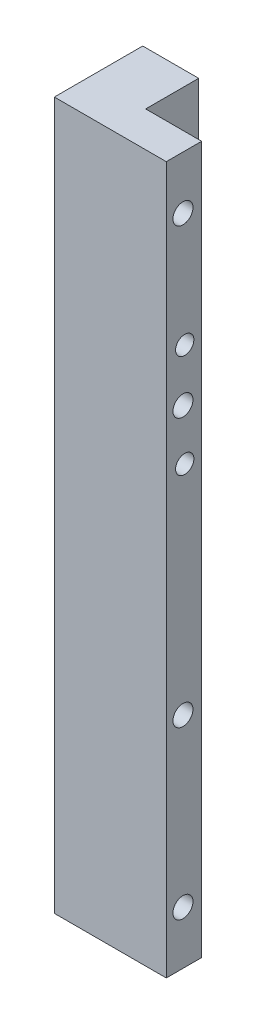
ISO-10303-21;
HEADER;
FILE_DESCRIPTION(('STEP AP214'),'2;1');
FILE_NAME('part.step','',(''),(''),'','','');
FILE_SCHEMA(('AUTOMOTIVE_DESIGN { 1 0 10303 214 1 1 1 1 }'));
ENDSEC;
DATA;
#1=APPLICATION_CONTEXT('core data for automotive mechanical design processes');
#2=APPLICATION_PROTOCOL_DEFINITION('international standard','automotive_design',2000,#1);
#3=PRODUCT_CONTEXT('',#1,'mechanical');
#4=PRODUCT('Part','Part','',(#3));
#5=PRODUCT_RELATED_PRODUCT_CATEGORY('part','',(#4));
#6=PRODUCT_DEFINITION_FORMATION('','',#4);
#7=PRODUCT_DEFINITION_CONTEXT('part definition',#1,'design');
#8=PRODUCT_DEFINITION('design','',#6,#7);
#9=PRODUCT_DEFINITION_SHAPE('','',#8);
#10=(LENGTH_UNIT() NAMED_UNIT(*) SI_UNIT(.MILLI.,.METRE.));
#11=(NAMED_UNIT(*) PLANE_ANGLE_UNIT() SI_UNIT($,.RADIAN.));
#12=(NAMED_UNIT(*) SI_UNIT($,.STERADIAN.) SOLID_ANGLE_UNIT());
#13=UNCERTAINTY_MEASURE_WITH_UNIT(LENGTH_MEASURE(1.E-05),#10,'distance_accuracy_value','');
#14=(GEOMETRIC_REPRESENTATION_CONTEXT(3) GLOBAL_UNCERTAINTY_ASSIGNED_CONTEXT((#13)) GLOBAL_UNIT_ASSIGNED_CONTEXT((#10,
#11,#12)) REPRESENTATION_CONTEXT('',''));
#15=CARTESIAN_POINT('',(0.,0.,0.));
#16=DIRECTION('',(0.,0.,1.));
#17=DIRECTION('',(1.,0.,0.));
#18=AXIS2_PLACEMENT_3D('',#15,#16,#17);
#19=CARTESIAN_POINT('',(0.,120.,3.));
#20=DIRECTION('',(0.,0.,-1.));
#21=DIRECTION('',(-1.,0.,0.));
#22=AXIS2_PLACEMENT_3D('',#19,#20,#21);
#23=PLANE('',#22);
#24=DIRECTION('',(1.,0.,0.));
#25=VECTOR('',#24,1.);
#26=CARTESIAN_POINT('',(0.,0.,3.));
#27=LINE('',#26,#25);
#28=CARTESIAN_POINT('',(-9.5,0.,3.));
#29=VERTEX_POINT('',#28);
#30=CARTESIAN_POINT('',(9.5,0.,3.));
#31=VERTEX_POINT('',#30);
#32=EDGE_CURVE('E119',#29,#31,#27,.T.);
#33=ORIENTED_EDGE('',*,*,#32,.T.);
#34=DIRECTION('',(0.,-1.,0.));
#35=VECTOR('',#34,1.);
#36=CARTESIAN_POINT('',(9.5,120.,3.));
#37=LINE('',#36,#35);
#38=CARTESIAN_POINT('',(9.5,120.,3.));
#39=VERTEX_POINT('',#38);
#40=EDGE_CURVE('E11',#39,#31,#37,.T.);
#41=ORIENTED_EDGE('',*,*,#40,.F.);
#42=DIRECTION('',(1.,0.,0.));
#43=VECTOR('',#42,1.);
#44=CARTESIAN_POINT('',(0.,120.,3.));
#45=LINE('',#44,#43);
#46=CARTESIAN_POINT('',(-9.5,120.,3.));
#47=VERTEX_POINT('',#46);
#48=EDGE_CURVE('E134',#47,#39,#45,.T.);
#49=ORIENTED_EDGE('',*,*,#48,.F.);
#50=DIRECTION('',(0.,-1.,0.));
#51=VECTOR('',#50,1.);
#52=CARTESIAN_POINT('',(-9.5,120.,3.));
#53=LINE('',#52,#51);
#54=EDGE_CURVE('E51',#47,#29,#53,.T.);
#55=ORIENTED_EDGE('',*,*,#54,.T.);
#56=EDGE_LOOP('',(#33,#41,#49,#55));
#57=FACE_BOUND('',#56,.T.);
#58=ADVANCED_FACE('F35',(#57),#23,.F.);
#59=CARTESIAN_POINT('',(9.5,120.,0.));
#60=DIRECTION('',(-1.,0.,0.));
#61=DIRECTION('',(0.,0.,1.));
#62=AXIS2_PLACEMENT_3D('',#59,#60,#61);
#63=PLANE('',#62);
#64=CARTESIAN_POINT('',(9.5,111.,0.170877535680921));
#65=DIRECTION('',(1.,0.,0.));
#66=DIRECTION('',(0.,0.,-1.));
#67=AXIS2_PLACEMENT_3D('',#64,#65,#66);
#68=CIRCLE('',#67,1.70000000000002);
#69=CARTESIAN_POINT('',(9.5,111.,-1.5291224643191));
#70=VERTEX_POINT('',#69);
#71=EDGE_CURVE('E178',#70,#70,#68,.F.);
#72=ORIENTED_EDGE('',*,*,#71,.T.);
#73=EDGE_LOOP('',(#72));
#74=FACE_BOUND('',#73,.T.);
#75=CARTESIAN_POINT('',(9.5,74.,-0.129122464319094));
#76=DIRECTION('',(1.,0.,0.));
#77=DIRECTION('',(0.,0.,-1.));
#78=AXIS2_PLACEMENT_3D('',#75,#76,#77);
#79=CIRCLE('',#78,1.55000000000001);
#80=CARTESIAN_POINT('',(9.5,74.,-1.67912246431911));
#81=VERTEX_POINT('',#80);
#82=EDGE_CURVE('E191',#81,#81,#79,.F.);
#83=ORIENTED_EDGE('',*,*,#82,.T.);
#84=EDGE_LOOP('',(#83));
#85=FACE_BOUND('',#84,.T.);
#86=CARTESIAN_POINT('',(9.5,82.75,0.170877535680921));
#87=DIRECTION('',(1.,0.,0.));
#88=DIRECTION('',(0.,0.,-1.));
#89=AXIS2_PLACEMENT_3D('',#86,#87,#88);
#90=CIRCLE('',#89,1.70000000000001);
#91=CARTESIAN_POINT('',(9.5,82.75,-1.52912246431909));
#92=VERTEX_POINT('',#91);
#93=EDGE_CURVE('E172',#92,#92,#90,.F.);
#94=ORIENTED_EDGE('',*,*,#93,.T.);
#95=EDGE_LOOP('',(#94));
#96=FACE_BOUND('',#95,.T.);
#97=CARTESIAN_POINT('',(9.5,37.2500000000001,0.170877535680907));
#98=DIRECTION('',(1.,0.,0.));
#99=DIRECTION('',(0.,0.,-1.));
#100=AXIS2_PLACEMENT_3D('',#97,#98,#99);
#101=CIRCLE('',#100,1.7);
#102=CARTESIAN_POINT('',(9.5,37.2500000000001,-1.5291224643191));
#103=VERTEX_POINT('',#102);
#104=EDGE_CURVE('E165',#103,#103,#101,.F.);
#105=ORIENTED_EDGE('',*,*,#104,.T.);
#106=EDGE_LOOP('',(#105));
#107=FACE_BOUND('',#106,.T.);
#108=CARTESIAN_POINT('',(9.5,8.99999999999998,0.170877535680907));
#109=DIRECTION('',(1.,0.,0.));
#110=DIRECTION('',(0.,0.,-1.));
#111=AXIS2_PLACEMENT_3D('',#108,#109,#110);
#112=CIRCLE('',#111,1.70000000000001);
#113=CARTESIAN_POINT('',(9.5,8.99999999999998,-1.52912246431911));
#114=VERTEX_POINT('',#113);
#115=EDGE_CURVE('E186',#114,#114,#112,.F.);
#116=ORIENTED_EDGE('',*,*,#115,.T.);
#117=EDGE_LOOP('',(#116));
#118=FACE_BOUND('',#117,.T.);
#119=CARTESIAN_POINT('',(9.5,91.5,-0.129122464319101));
#120=DIRECTION('',(1.,0.,0.));
#121=DIRECTION('',(0.,0.,-1.));
#122=AXIS2_PLACEMENT_3D('',#119,#120,#121);
#123=CIRCLE('',#122,1.54999999999999);
#124=CARTESIAN_POINT('',(9.5,91.5,-1.6791224643191));
#125=VERTEX_POINT('',#124);
#126=EDGE_CURVE('E179',#125,#125,#123,.F.);
#127=ORIENTED_EDGE('',*,*,#126,.T.);
#128=EDGE_LOOP('',(#127));
#129=FACE_BOUND('',#128,.T.);
#130=DIRECTION('',(0.,0.,-1.));
#131=VECTOR('',#130,1.);
#132=CARTESIAN_POINT('',(9.5,0.,0.));
#133=LINE('',#132,#131);
#134=CARTESIAN_POINT('',(9.5,0.,-3.));
#135=VERTEX_POINT('',#134);
#136=EDGE_CURVE('E121',#31,#135,#133,.T.);
#137=ORIENTED_EDGE('',*,*,#136,.T.);
#138=DIRECTION('',(0.,-1.,0.));
#139=VECTOR('',#138,1.);
#140=CARTESIAN_POINT('',(9.5,120.,-3.));
#141=LINE('',#140,#139);
#142=CARTESIAN_POINT('',(9.5,120.,-3.));
#143=VERTEX_POINT('',#142);
#144=EDGE_CURVE('E43',#143,#135,#141,.T.);
#145=ORIENTED_EDGE('',*,*,#144,.F.);
#146=DIRECTION('',(0.,0.,-1.));
#147=VECTOR('',#146,1.);
#148=CARTESIAN_POINT('',(9.5,120.,0.));
#149=LINE('',#148,#147);
#150=EDGE_CURVE('E83',#39,#143,#149,.T.);
#151=ORIENTED_EDGE('',*,*,#150,.F.);
#152=ORIENTED_EDGE('',*,*,#40,.T.);
#153=EDGE_LOOP('',(#137,#145,#151,#152));
#154=FACE_BOUND('',#153,.T.);
#155=ADVANCED_FACE('F140',(#74,#85,#96,#107,#118,#129,#154),#63,.F.);
#156=CARTESIAN_POINT('',(0.,120.,-3.));
#157=DIRECTION('',(0.,0.,-1.));
#158=DIRECTION('',(-1.,0.,0.));
#159=AXIS2_PLACEMENT_3D('',#156,#157,#158);
#160=PLANE('',#159);
#161=DIRECTION('',(1.,0.,0.));
#162=VECTOR('',#161,1.);
#163=CARTESIAN_POINT('',(0.,0.,-3.));
#164=LINE('',#163,#162);
#165=CARTESIAN_POINT('',(0.,0.,-3.));
#166=VERTEX_POINT('',#165);
#167=EDGE_CURVE('E125',#166,#135,#164,.T.);
#168=ORIENTED_EDGE('',*,*,#167,.F.);
#169=DIRECTION('',(0.,-1.,0.));
#170=VECTOR('',#169,1.);
#171=CARTESIAN_POINT('',(0.,120.,-3.));
#172=LINE('',#171,#170);
#173=CARTESIAN_POINT('',(0.,120.,-3.));
#174=VERTEX_POINT('',#173);
#175=EDGE_CURVE('E111',#174,#166,#172,.T.);
#176=ORIENTED_EDGE('',*,*,#175,.F.);
#177=DIRECTION('',(1.,0.,0.));
#178=VECTOR('',#177,1.);
#179=CARTESIAN_POINT('',(0.,120.,-3.));
#180=LINE('',#179,#178);
#181=EDGE_CURVE('E101',#174,#143,#180,.T.);
#182=ORIENTED_EDGE('',*,*,#181,.T.);
#183=ORIENTED_EDGE('',*,*,#144,.T.);
#184=EDGE_LOOP('',(#168,#176,#182,#183));
#185=FACE_BOUND('',#184,.T.);
#186=ADVANCED_FACE('F139',(#185),#160,.T.);
#187=CARTESIAN_POINT('',(0.,120.,0.));
#188=DIRECTION('',(-1.,0.,0.));
#189=DIRECTION('',(0.,0.,1.));
#190=AXIS2_PLACEMENT_3D('',#187,#188,#189);
#191=PLANE('',#190);
#192=DIRECTION('',(0.,0.,-1.));
#193=VECTOR('',#192,1.);
#194=CARTESIAN_POINT('',(0.,0.,0.));
#195=LINE('',#194,#193);
#196=CARTESIAN_POINT('',(0.,0.,-12.));
#197=VERTEX_POINT('',#196);
#198=EDGE_CURVE('E108',#166,#197,#195,.T.);
#199=ORIENTED_EDGE('',*,*,#198,.T.);
#200=DIRECTION('',(0.,-1.,0.));
#201=VECTOR('',#200,1.);
#202=CARTESIAN_POINT('',(0.,120.,-12.));
#203=LINE('',#202,#201);
#204=CARTESIAN_POINT('',(0.,120.,-12.));
#205=VERTEX_POINT('',#204);
#206=EDGE_CURVE('E105',#205,#197,#203,.T.);
#207=ORIENTED_EDGE('',*,*,#206,.F.);
#208=DIRECTION('',(0.,0.,-1.));
#209=VECTOR('',#208,1.);
#210=CARTESIAN_POINT('',(0.,120.,0.));
#211=LINE('',#210,#209);
#212=EDGE_CURVE('E94',#174,#205,#211,.T.);
#213=ORIENTED_EDGE('',*,*,#212,.F.);
#214=ORIENTED_EDGE('',*,*,#175,.T.);
#215=EDGE_LOOP('',(#199,#207,#213,#214));
#216=FACE_BOUND('',#215,.T.);
#217=ADVANCED_FACE('F106',(#216),#191,.F.);
#218=CARTESIAN_POINT('',(0.,120.,-12.));
#219=DIRECTION('',(0.,0.,-1.));
#220=DIRECTION('',(-1.,0.,0.));
#221=AXIS2_PLACEMENT_3D('',#218,#219,#220);
#222=PLANE('',#221);
#223=DIRECTION('',(1.,0.,0.));
#224=VECTOR('',#223,1.);
#225=CARTESIAN_POINT('',(0.,0.,-12.));
#226=LINE('',#225,#224);
#227=CARTESIAN_POINT('',(-9.5,0.,-12.));
#228=VERTEX_POINT('',#227);
#229=EDGE_CURVE('E129',#228,#197,#226,.T.);
#230=ORIENTED_EDGE('',*,*,#229,.F.);
#231=DIRECTION('',(0.,-1.,0.));
#232=VECTOR('',#231,1.);
#233=CARTESIAN_POINT('',(-9.5,120.,-12.));
#234=LINE('',#233,#232);
#235=CARTESIAN_POINT('',(-9.5,120.,-12.));
#236=VERTEX_POINT('',#235);
#237=EDGE_CURVE('E71',#236,#228,#234,.T.);
#238=ORIENTED_EDGE('',*,*,#237,.F.);
#239=DIRECTION('',(1.,0.,0.));
#240=VECTOR('',#239,1.);
#241=CARTESIAN_POINT('',(0.,120.,-12.));
#242=LINE('',#241,#240);
#243=EDGE_CURVE('E99',#236,#205,#242,.T.);
#244=ORIENTED_EDGE('',*,*,#243,.T.);
#245=ORIENTED_EDGE('',*,*,#206,.T.);
#246=EDGE_LOOP('',(#230,#238,#244,#245));
#247=FACE_BOUND('',#246,.T.);
#248=ADVANCED_FACE('F113',(#247),#222,.T.);
#249=CARTESIAN_POINT('',(-9.5,120.,0.));
#250=DIRECTION('',(-1.,0.,0.));
#251=DIRECTION('',(0.,0.,1.));
#252=AXIS2_PLACEMENT_3D('',#249,#250,#251);
#253=PLANE('',#252);
#254=CARTESIAN_POINT('',(-9.49999999999999,111.,0.170877535680921));
#255=DIRECTION('',(1.,0.,0.));
#256=DIRECTION('',(0.,0.,-1.));
#257=AXIS2_PLACEMENT_3D('',#254,#255,#256);
#258=CIRCLE('',#257,1.70000000000002);
#259=CARTESIAN_POINT('',(-9.49999999999999,111.,-1.5291224643191));
#260=VERTEX_POINT('',#259);
#261=EDGE_CURVE('E122',#260,#260,#258,.F.);
#262=ORIENTED_EDGE('',*,*,#261,.F.);
#263=EDGE_LOOP('',(#262));
#264=FACE_BOUND('',#263,.T.);
#265=CARTESIAN_POINT('',(-9.49999999999999,74.,-0.129122464319094));
#266=DIRECTION('',(1.,0.,0.));
#267=DIRECTION('',(0.,0.,-1.));
#268=AXIS2_PLACEMENT_3D('',#265,#266,#267);
#269=CIRCLE('',#268,1.55000000000001);
#270=CARTESIAN_POINT('',(-9.49999999999999,74.,-1.67912246431911));
#271=VERTEX_POINT('',#270);
#272=EDGE_CURVE('E183',#271,#271,#269,.F.);
#273=ORIENTED_EDGE('',*,*,#272,.F.);
#274=EDGE_LOOP('',(#273));
#275=FACE_BOUND('',#274,.T.);
#276=CARTESIAN_POINT('',(-9.49999999999999,82.75,0.170877535680921));
#277=DIRECTION('',(1.,0.,0.));
#278=DIRECTION('',(0.,0.,-1.));
#279=AXIS2_PLACEMENT_3D('',#276,#277,#278);
#280=CIRCLE('',#279,1.70000000000001);
#281=CARTESIAN_POINT('',(-9.49999999999999,82.75,-1.52912246431909));
#282=VERTEX_POINT('',#281);
#283=EDGE_CURVE('E175',#282,#282,#280,.F.);
#284=ORIENTED_EDGE('',*,*,#283,.F.);
#285=EDGE_LOOP('',(#284));
#286=FACE_BOUND('',#285,.T.);
#287=CARTESIAN_POINT('',(-9.49999999999999,37.2500000000001,0.170877535680907));
#288=DIRECTION('',(1.,0.,0.));
#289=DIRECTION('',(0.,0.,-1.));
#290=AXIS2_PLACEMENT_3D('',#287,#288,#289);
#291=CIRCLE('',#290,1.7);
#292=CARTESIAN_POINT('',(-9.49999999999999,37.2500000000001,-1.5291224643191));
#293=VERTEX_POINT('',#292);
#294=EDGE_CURVE('E168',#293,#293,#291,.F.);
#295=ORIENTED_EDGE('',*,*,#294,.F.);
#296=EDGE_LOOP('',(#295));
#297=FACE_BOUND('',#296,.T.);
#298=CARTESIAN_POINT('',(-9.49999999999999,8.99999999999998,0.170877535680907));
#299=DIRECTION('',(1.,0.,0.));
#300=DIRECTION('',(0.,0.,-1.));
#301=AXIS2_PLACEMENT_3D('',#298,#299,#300);
#302=CIRCLE('',#301,1.70000000000001);
#303=CARTESIAN_POINT('',(-9.49999999999999,8.99999999999998,-1.52912246431911));
#304=VERTEX_POINT('',#303);
#305=EDGE_CURVE('E169',#304,#304,#302,.F.);
#306=ORIENTED_EDGE('',*,*,#305,.F.);
#307=EDGE_LOOP('',(#306));
#308=FACE_BOUND('',#307,.T.);
#309=CARTESIAN_POINT('',(-9.49999999999999,91.5,-0.129122464319101));
#310=DIRECTION('',(1.,0.,0.));
#311=DIRECTION('',(0.,0.,-1.));
#312=AXIS2_PLACEMENT_3D('',#309,#310,#311);
#313=CIRCLE('',#312,1.54999999999999);
#314=CARTESIAN_POINT('',(-9.49999999999999,91.5,-1.6791224643191));
#315=VERTEX_POINT('',#314);
#316=EDGE_CURVE('E182',#315,#315,#313,.F.);
#317=ORIENTED_EDGE('',*,*,#316,.F.);
#318=EDGE_LOOP('',(#317));
#319=FACE_BOUND('',#318,.T.);
#320=DIRECTION('',(0.,0.,-1.));
#321=VECTOR('',#320,1.);
#322=CARTESIAN_POINT('',(-9.5,0.,0.));
#323=LINE('',#322,#321);
#324=EDGE_CURVE('E131',#29,#228,#323,.T.);
#325=ORIENTED_EDGE('',*,*,#324,.F.);
#326=ORIENTED_EDGE('',*,*,#54,.F.);
#327=DIRECTION('',(0.,0.,-1.));
#328=VECTOR('',#327,1.);
#329=CARTESIAN_POINT('',(-9.5,120.,0.));
#330=LINE('',#329,#328);
#331=EDGE_CURVE('E114',#47,#236,#330,.T.);
#332=ORIENTED_EDGE('',*,*,#331,.T.);
#333=ORIENTED_EDGE('',*,*,#237,.T.);
#334=EDGE_LOOP('',(#325,#326,#332,#333));
#335=FACE_BOUND('',#334,.T.);
#336=ADVANCED_FACE('F144',(#264,#275,#286,#297,#308,#319,#335),#253,.T.);
#337=CARTESIAN_POINT('',(0.,120.,0.));
#338=DIRECTION('',(0.,1.,0.));
#339=DIRECTION('',(0.,0.,1.));
#340=AXIS2_PLACEMENT_3D('',#337,#338,#339);
#341=PLANE('',#340);
#342=ORIENTED_EDGE('',*,*,#48,.T.);
#343=ORIENTED_EDGE('',*,*,#150,.T.);
#344=ORIENTED_EDGE('',*,*,#181,.F.);
#345=ORIENTED_EDGE('',*,*,#212,.T.);
#346=ORIENTED_EDGE('',*,*,#243,.F.);
#347=ORIENTED_EDGE('',*,*,#331,.F.);
#348=EDGE_LOOP('',(#342,#343,#344,#345,#346,#347));
#349=FACE_BOUND('',#348,.T.);
#350=ADVANCED_FACE('F96',(#349),#341,.T.);
#351=CARTESIAN_POINT('',(0.,0.,0.));
#352=DIRECTION('',(0.,1.,0.));
#353=DIRECTION('',(0.,0.,1.));
#354=AXIS2_PLACEMENT_3D('',#351,#352,#353);
#355=PLANE('',#354);
#356=ORIENTED_EDGE('',*,*,#32,.F.);
#357=ORIENTED_EDGE('',*,*,#324,.T.);
#358=ORIENTED_EDGE('',*,*,#229,.T.);
#359=ORIENTED_EDGE('',*,*,#198,.F.);
#360=ORIENTED_EDGE('',*,*,#167,.T.);
#361=ORIENTED_EDGE('',*,*,#136,.F.);
#362=EDGE_LOOP('',(#356,#357,#358,#359,#360,#361));
#363=FACE_BOUND('',#362,.T.);
#364=ADVANCED_FACE('F143',(#363),#355,.F.);
#365=CARTESIAN_POINT('',(-9.49999999999999,91.5,-0.129122464319101));
#366=DIRECTION('',(1.,0.,0.));
#367=DIRECTION('',(0.,0.,-1.));
#368=AXIS2_PLACEMENT_3D('',#365,#366,#367);
#369=CYLINDRICAL_SURFACE('',#368,1.54999999999999);
#370=ORIENTED_EDGE('',*,*,#316,.T.);
#371=EDGE_LOOP('',(#370));
#372=FACE_BOUND('',#371,.T.);
#373=ORIENTED_EDGE('',*,*,#126,.F.);
#374=EDGE_LOOP('',(#373));
#375=FACE_BOUND('',#374,.T.);
#376=ADVANCED_FACE('F217',(#372,#375),#369,.F.);
#377=CARTESIAN_POINT('',(-9.49999999999999,8.99999999999998,0.170877535680907));
#378=DIRECTION('',(1.,0.,0.));
#379=DIRECTION('',(0.,0.,-1.));
#380=AXIS2_PLACEMENT_3D('',#377,#378,#379);
#381=CYLINDRICAL_SURFACE('',#380,1.70000000000001);
#382=ORIENTED_EDGE('',*,*,#305,.T.);
#383=EDGE_LOOP('',(#382));
#384=FACE_BOUND('',#383,.T.);
#385=ORIENTED_EDGE('',*,*,#115,.F.);
#386=EDGE_LOOP('',(#385));
#387=FACE_BOUND('',#386,.T.);
#388=ADVANCED_FACE('F219',(#384,#387),#381,.F.);
#389=CARTESIAN_POINT('',(-9.49999999999999,37.2500000000001,0.170877535680907));
#390=DIRECTION('',(1.,0.,0.));
#391=DIRECTION('',(0.,0.,-1.));
#392=AXIS2_PLACEMENT_3D('',#389,#390,#391);
#393=CYLINDRICAL_SURFACE('',#392,1.7);
#394=ORIENTED_EDGE('',*,*,#294,.T.);
#395=EDGE_LOOP('',(#394));
#396=FACE_BOUND('',#395,.T.);
#397=ORIENTED_EDGE('',*,*,#104,.F.);
#398=EDGE_LOOP('',(#397));
#399=FACE_BOUND('',#398,.T.);
#400=ADVANCED_FACE('F226',(#396,#399),#393,.F.);
#401=CARTESIAN_POINT('',(-9.49999999999999,82.75,0.170877535680921));
#402=DIRECTION('',(1.,0.,0.));
#403=DIRECTION('',(0.,0.,-1.));
#404=AXIS2_PLACEMENT_3D('',#401,#402,#403);
#405=CYLINDRICAL_SURFACE('',#404,1.70000000000001);
#406=ORIENTED_EDGE('',*,*,#283,.T.);
#407=EDGE_LOOP('',(#406));
#408=FACE_BOUND('',#407,.T.);
#409=ORIENTED_EDGE('',*,*,#93,.F.);
#410=EDGE_LOOP('',(#409));
#411=FACE_BOUND('',#410,.T.);
#412=ADVANCED_FACE('F231',(#408,#411),#405,.F.);
#413=CARTESIAN_POINT('',(-9.49999999999999,74.,-0.129122464319094));
#414=DIRECTION('',(1.,0.,0.));
#415=DIRECTION('',(0.,0.,-1.));
#416=AXIS2_PLACEMENT_3D('',#413,#414,#415);
#417=CYLINDRICAL_SURFACE('',#416,1.55000000000001);
#418=ORIENTED_EDGE('',*,*,#272,.T.);
#419=EDGE_LOOP('',(#418));
#420=FACE_BOUND('',#419,.T.);
#421=ORIENTED_EDGE('',*,*,#82,.F.);
#422=EDGE_LOOP('',(#421));
#423=FACE_BOUND('',#422,.T.);
#424=ADVANCED_FACE('F203',(#420,#423),#417,.F.);
#425=CARTESIAN_POINT('',(-9.49999999999999,111.,0.170877535680921));
#426=DIRECTION('',(1.,0.,0.));
#427=DIRECTION('',(0.,0.,-1.));
#428=AXIS2_PLACEMENT_3D('',#425,#426,#427);
#429=CYLINDRICAL_SURFACE('',#428,1.70000000000002);
#430=ORIENTED_EDGE('',*,*,#261,.T.);
#431=EDGE_LOOP('',(#430));
#432=FACE_BOUND('',#431,.T.);
#433=ORIENTED_EDGE('',*,*,#71,.F.);
#434=EDGE_LOOP('',(#433));
#435=FACE_BOUND('',#434,.T.);
#436=ADVANCED_FACE('F200',(#432,#435),#429,.F.);
#437=CLOSED_SHELL('',(#58,#155,#186,#217,#248,#336,#350,#364,#376,#388,#400,#412,#424,#436));
#438=MANIFOLD_SOLID_BREP('B2',#437);
#439=ADVANCED_BREP_SHAPE_REPRESENTATION('',(#18,#438),#14);
#440=SHAPE_DEFINITION_REPRESENTATION(#9,#439);
ENDSEC;
END-ISO-10303-21;
